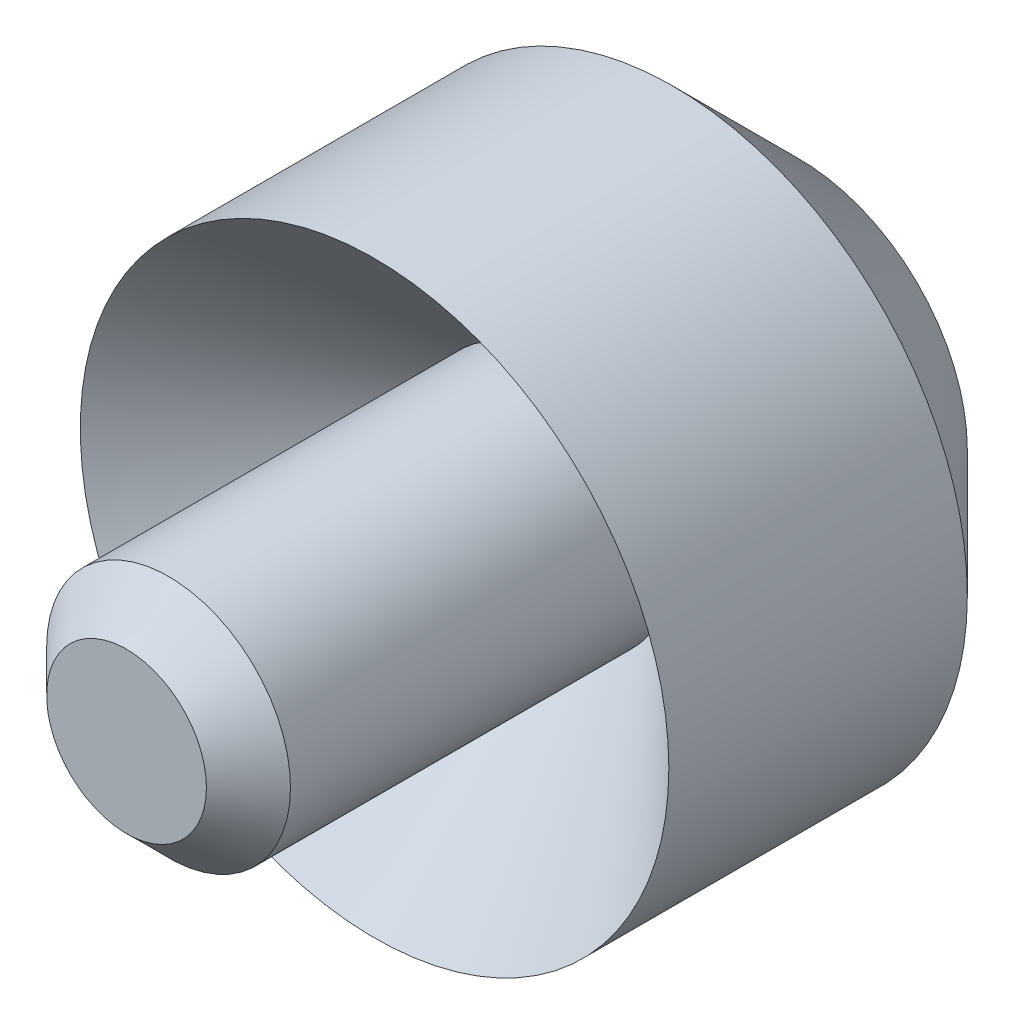
ISO-10303-21;
HEADER;
FILE_DESCRIPTION(('STEP AP214'),'2;1');
FILE_NAME('part.step','',(''),(''),'','','');
FILE_SCHEMA(('AUTOMOTIVE_DESIGN { 1 0 10303 214 1 1 1 1 }'));
ENDSEC;
DATA;
#1=APPLICATION_CONTEXT('core data for automotive mechanical design processes');
#2=APPLICATION_PROTOCOL_DEFINITION('international standard','automotive_design',2000,#1);
#3=PRODUCT_CONTEXT('',#1,'mechanical');
#4=PRODUCT('Part','Part','',(#3));
#5=PRODUCT_RELATED_PRODUCT_CATEGORY('part','',(#4));
#6=PRODUCT_DEFINITION_FORMATION('','',#4);
#7=PRODUCT_DEFINITION_CONTEXT('part definition',#1,'design');
#8=PRODUCT_DEFINITION('design','',#6,#7);
#9=PRODUCT_DEFINITION_SHAPE('','',#8);
#10=(LENGTH_UNIT() NAMED_UNIT(*) SI_UNIT(.MILLI.,.METRE.));
#11=(NAMED_UNIT(*) PLANE_ANGLE_UNIT() SI_UNIT($,.RADIAN.));
#12=(NAMED_UNIT(*) SI_UNIT($,.STERADIAN.) SOLID_ANGLE_UNIT());
#13=UNCERTAINTY_MEASURE_WITH_UNIT(LENGTH_MEASURE(1.E-05),#10,'distance_accuracy_value','');
#14=(GEOMETRIC_REPRESENTATION_CONTEXT(3) GLOBAL_UNCERTAINTY_ASSIGNED_CONTEXT((#13)) GLOBAL_UNIT_ASSIGNED_CONTEXT((#10,
#11,#12)) REPRESENTATION_CONTEXT('',''));
#15=CARTESIAN_POINT('',(0.,0.,0.));
#16=DIRECTION('',(0.,0.,1.));
#17=DIRECTION('',(1.,0.,0.));
#18=AXIS2_PLACEMENT_3D('',#15,#16,#17);
#19=CARTESIAN_POINT('',(0.,0.,5.));
#20=DIRECTION('',(0.,0.,-1.));
#21=DIRECTION('',(-1.,0.,0.));
#22=AXIS2_PLACEMENT_3D('',#19,#20,#21);
#23=CYLINDRICAL_SURFACE('',#22,1.45);
#24=CARTESIAN_POINT('',(0.,0.,4.5));
#25=DIRECTION('',(0.,0.,1.));
#26=DIRECTION('',(1.,0.,0.));
#27=AXIS2_PLACEMENT_3D('',#24,#25,#26);
#28=CIRCLE('',#27,1.45);
#29=CARTESIAN_POINT('',(1.45,0.,4.5));
#30=VERTEX_POINT('',#29);
#31=EDGE_CURVE('E10',#30,#30,#28,.F.);
#32=ORIENTED_EDGE('',*,*,#31,.T.);
#33=EDGE_LOOP('',(#32));
#34=FACE_BOUND('',#33,.T.);
#35=CARTESIAN_POINT('',(0.,0.,0.));
#36=DIRECTION('',(0.,0.,1.));
#37=DIRECTION('',(1.,0.,0.));
#38=AXIS2_PLACEMENT_3D('',#35,#36,#37);
#39=CIRCLE('',#38,1.45);
#40=CARTESIAN_POINT('',(1.45,0.,0.));
#41=VERTEX_POINT('',#40);
#42=EDGE_CURVE('E54',#41,#41,#39,.T.);
#43=ORIENTED_EDGE('',*,*,#42,.T.);
#44=EDGE_LOOP('',(#43));
#45=FACE_BOUND('',#44,.T.);
#46=ADVANCED_FACE('F31',(#34,#45),#23,.T.);
#47=CARTESIAN_POINT('',(0.,0.,5.));
#48=DIRECTION('',(0.,0.,1.));
#49=DIRECTION('',(1.,0.,0.));
#50=AXIS2_PLACEMENT_3D('',#47,#48,#49);
#51=PLANE('',#50);
#52=CARTESIAN_POINT('',(0.,0.,5.));
#53=DIRECTION('',(0.,0.,1.));
#54=DIRECTION('',(1.,0.,0.));
#55=AXIS2_PLACEMENT_3D('',#52,#53,#54);
#56=CIRCLE('',#55,0.950000000000001);
#57=CARTESIAN_POINT('',(0.950000000000001,0.,5.));
#58=VERTEX_POINT('',#57);
#59=EDGE_CURVE('E38',#58,#58,#56,.T.);
#60=ORIENTED_EDGE('',*,*,#59,.T.);
#61=EDGE_LOOP('',(#60));
#62=FACE_BOUND('',#61,.T.);
#63=ADVANCED_FACE('F73',(#62),#51,.T.);
#64=CARTESIAN_POINT('',(0.,0.,-3.));
#65=DIRECTION('',(0.,0.,-1.));
#66=DIRECTION('',(-1.,0.,0.));
#67=AXIS2_PLACEMENT_3D('',#64,#65,#66);
#68=PLANE('',#67);
#69=CARTESIAN_POINT('',(0.,0.,-3.));
#70=DIRECTION('',(0.,0.,1.));
#71=DIRECTION('',(1.,0.,0.));
#72=AXIS2_PLACEMENT_3D('',#69,#70,#71);
#73=CIRCLE('',#72,2.);
#74=CARTESIAN_POINT('',(2.,0.,-3.));
#75=VERTEX_POINT('',#74);
#76=EDGE_CURVE('E42',#75,#75,#73,.T.);
#77=ORIENTED_EDGE('',*,*,#76,.F.);
#78=EDGE_LOOP('',(#77));
#79=FACE_BOUND('',#78,.T.);
#80=ADVANCED_FACE('F77',(#79),#68,.T.);
#81=CARTESIAN_POINT('',(0.,0.,-1.50000000000001));
#82=DIRECTION('',(0.,0.,1.));
#83=DIRECTION('',(1.,0.,0.));
#84=AXIS2_PLACEMENT_3D('',#81,#82,#83);
#85=CONICAL_SURFACE('',#84,3.5,0.785398163397451);
#86=ORIENTED_EDGE('',*,*,#76,.T.);
#87=EDGE_LOOP('',(#86));
#88=FACE_BOUND('',#87,.T.);
#89=CARTESIAN_POINT('',(0.,0.,-1.50000000000001));
#90=DIRECTION('',(0.,0.,1.));
#91=DIRECTION('',(1.,0.,0.));
#92=AXIS2_PLACEMENT_3D('',#89,#90,#91);
#93=CIRCLE('',#92,3.5);
#94=CARTESIAN_POINT('',(3.5,0.,-1.50000000000001));
#95=VERTEX_POINT('',#94);
#96=EDGE_CURVE('E46',#95,#95,#93,.T.);
#97=ORIENTED_EDGE('',*,*,#96,.F.);
#98=EDGE_LOOP('',(#97));
#99=FACE_BOUND('',#98,.T.);
#100=ADVANCED_FACE('F69',(#88,#99),#85,.T.);
#101=CARTESIAN_POINT('',(0.,0.,0.));
#102=DIRECTION('',(0.,0.,1.));
#103=DIRECTION('',(1.,0.,0.));
#104=AXIS2_PLACEMENT_3D('',#101,#102,#103);
#105=CYLINDRICAL_SURFACE('',#104,3.5);
#106=ORIENTED_EDGE('',*,*,#96,.T.);
#107=EDGE_LOOP('',(#106));
#108=FACE_BOUND('',#107,.T.);
#109=CARTESIAN_POINT('',(0.,0.,2.05000000000002));
#110=DIRECTION('',(0.,0.,1.));
#111=DIRECTION('',(1.,0.,0.));
#112=AXIS2_PLACEMENT_3D('',#109,#110,#111);
#113=CIRCLE('',#112,3.5);
#114=CARTESIAN_POINT('',(3.5,0.,2.05000000000002));
#115=VERTEX_POINT('',#114);
#116=EDGE_CURVE('E51',#115,#115,#113,.T.);
#117=ORIENTED_EDGE('',*,*,#116,.F.);
#118=EDGE_LOOP('',(#117));
#119=FACE_BOUND('',#118,.T.);
#120=ADVANCED_FACE('F61',(#108,#119),#105,.T.);
#121=CARTESIAN_POINT('',(0.,0.,0.));
#122=DIRECTION('',(0.,0.,1.));
#123=DIRECTION('',(1.,0.,0.));
#124=AXIS2_PLACEMENT_3D('',#121,#122,#123);
#125=CONICAL_SURFACE('',#124,1.45,0.785398163397443);
#126=ORIENTED_EDGE('',*,*,#116,.T.);
#127=EDGE_LOOP('',(#126));
#128=FACE_BOUND('',#127,.T.);
#129=ORIENTED_EDGE('',*,*,#42,.F.);
#130=EDGE_LOOP('',(#129));
#131=FACE_BOUND('',#130,.T.);
#132=ADVANCED_FACE('F59',(#128,#131),#125,.F.);
#133=CARTESIAN_POINT('',(0.,0.,5.));
#134=DIRECTION('',(0.,0.,-1.));
#135=DIRECTION('',(-1.,0.,0.));
#136=AXIS2_PLACEMENT_3D('',#133,#134,#135);
#137=CONICAL_SURFACE('',#136,0.950000000000001,0.785398163397447);
#138=ORIENTED_EDGE('',*,*,#31,.F.);
#139=EDGE_LOOP('',(#138));
#140=FACE_BOUND('',#139,.T.);
#141=ORIENTED_EDGE('',*,*,#59,.F.);
#142=EDGE_LOOP('',(#141));
#143=FACE_BOUND('',#142,.T.);
#144=ADVANCED_FACE('F33',(#140,#143),#137,.T.);
#145=CLOSED_SHELL('',(#46,#63,#80,#100,#120,#132,#144));
#146=MANIFOLD_SOLID_BREP('B2',#145);
#147=ADVANCED_BREP_SHAPE_REPRESENTATION('',(#18,#146),#14);
#148=SHAPE_DEFINITION_REPRESENTATION(#9,#147);
ENDSEC;
END-ISO-10303-21;
